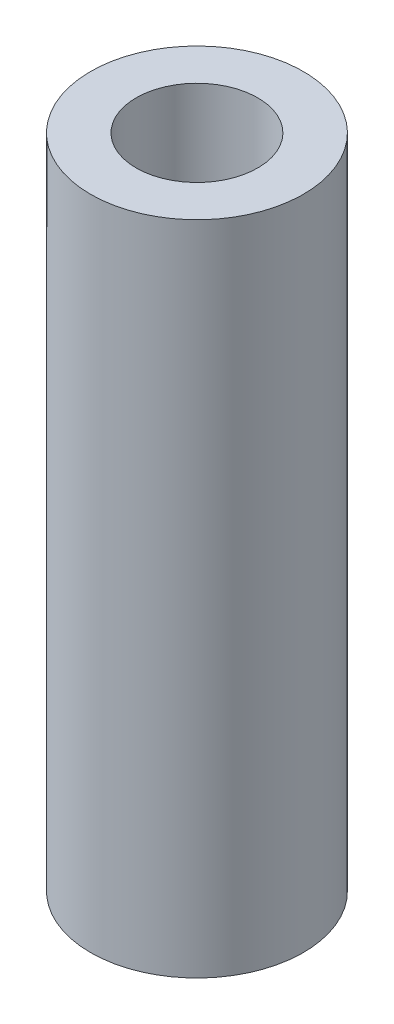
ISO-10303-21;
HEADER;
FILE_DESCRIPTION(('STEP AP214'),'2;1');
FILE_NAME('part.step','',(''),(''),'','','');
FILE_SCHEMA(('AUTOMOTIVE_DESIGN { 1 0 10303 214 1 1 1 1 }'));
ENDSEC;
DATA;
#1=APPLICATION_CONTEXT('core data for automotive mechanical design processes');
#2=APPLICATION_PROTOCOL_DEFINITION('international standard','automotive_design',2000,#1);
#3=PRODUCT_CONTEXT('',#1,'mechanical');
#4=PRODUCT('Part','Part','',(#3));
#5=PRODUCT_RELATED_PRODUCT_CATEGORY('part','',(#4));
#6=PRODUCT_DEFINITION_FORMATION('','',#4);
#7=PRODUCT_DEFINITION_CONTEXT('part definition',#1,'design');
#8=PRODUCT_DEFINITION('design','',#6,#7);
#9=PRODUCT_DEFINITION_SHAPE('','',#8);
#10=(LENGTH_UNIT() NAMED_UNIT(*) SI_UNIT(.MILLI.,.METRE.));
#11=(NAMED_UNIT(*) PLANE_ANGLE_UNIT() SI_UNIT($,.RADIAN.));
#12=(NAMED_UNIT(*) SI_UNIT($,.STERADIAN.) SOLID_ANGLE_UNIT());
#13=UNCERTAINTY_MEASURE_WITH_UNIT(LENGTH_MEASURE(1.E-05),#10,'distance_accuracy_value','');
#14=(GEOMETRIC_REPRESENTATION_CONTEXT(3) GLOBAL_UNCERTAINTY_ASSIGNED_CONTEXT((#13)) GLOBAL_UNIT_ASSIGNED_CONTEXT((#10,
#11,#12)) REPRESENTATION_CONTEXT('',''));
#15=CARTESIAN_POINT('',(0.,0.,0.));
#16=DIRECTION('',(0.,0.,1.));
#17=DIRECTION('',(1.,0.,0.));
#18=AXIS2_PLACEMENT_3D('',#15,#16,#17);
#19=CARTESIAN_POINT('',(0.,27.432,0.));
#20=DIRECTION('',(0.,1.,0.));
#21=DIRECTION('',(0.,0.,1.));
#22=AXIS2_PLACEMENT_3D('',#19,#20,#21);
#23=PLANE('',#22);
#24=CARTESIAN_POINT('',(0.,27.432,0.));
#25=DIRECTION('',(0.,1.,0.));
#26=DIRECTION('',(0.,0.,1.));
#27=AXIS2_PLACEMENT_3D('',#24,#25,#26);
#28=CIRCLE('',#27,4.445);
#29=CARTESIAN_POINT('',(0.,27.432,4.445));
#30=VERTEX_POINT('',#29);
#31=EDGE_CURVE('E10',#30,#30,#28,.T.);
#32=ORIENTED_EDGE('',*,*,#31,.T.);
#33=EDGE_LOOP('',(#32));
#34=FACE_BOUND('',#33,.T.);
#35=CARTESIAN_POINT('',(0.,27.432,0.));
#36=DIRECTION('',(0.,1.,0.));
#37=DIRECTION('',(0.,0.,1.));
#38=AXIS2_PLACEMENT_3D('',#35,#36,#37);
#39=CIRCLE('',#38,2.54);
#40=CARTESIAN_POINT('',(0.,27.432,2.54));
#41=VERTEX_POINT('',#40);
#42=EDGE_CURVE('E41',#41,#41,#39,.T.);
#43=ORIENTED_EDGE('',*,*,#42,.F.);
#44=EDGE_LOOP('',(#43));
#45=FACE_BOUND('',#44,.T.);
#46=ADVANCED_FACE('F30',(#34,#45),#23,.T.);
#47=CARTESIAN_POINT('',(0.,0.,0.));
#48=DIRECTION('',(0.,1.,0.));
#49=DIRECTION('',(0.,0.,1.));
#50=AXIS2_PLACEMENT_3D('',#47,#48,#49);
#51=PLANE('',#50);
#52=CARTESIAN_POINT('',(0.,0.,0.));
#53=DIRECTION('',(0.,1.,0.));
#54=DIRECTION('',(0.,0.,1.));
#55=AXIS2_PLACEMENT_3D('',#52,#53,#54);
#56=CIRCLE('',#55,4.445);
#57=CARTESIAN_POINT('',(0.,0.,4.445));
#58=VERTEX_POINT('',#57);
#59=EDGE_CURVE('E34',#58,#58,#56,.T.);
#60=ORIENTED_EDGE('',*,*,#59,.F.);
#61=EDGE_LOOP('',(#60));
#62=FACE_BOUND('',#61,.T.);
#63=CARTESIAN_POINT('',(0.,0.,0.));
#64=DIRECTION('',(0.,1.,0.));
#65=DIRECTION('',(0.,0.,1.));
#66=AXIS2_PLACEMENT_3D('',#63,#64,#65);
#67=CIRCLE('',#66,2.54);
#68=CARTESIAN_POINT('',(0.,0.,2.54));
#69=VERTEX_POINT('',#68);
#70=EDGE_CURVE('E43',#69,#69,#67,.T.);
#71=ORIENTED_EDGE('',*,*,#70,.T.);
#72=EDGE_LOOP('',(#71));
#73=FACE_BOUND('',#72,.T.);
#74=ADVANCED_FACE('F53',(#62,#73),#51,.F.);
#75=CARTESIAN_POINT('',(0.,27.432,0.));
#76=DIRECTION('',(0.,-1.,0.));
#77=DIRECTION('',(0.,0.,-1.));
#78=AXIS2_PLACEMENT_3D('',#75,#76,#77);
#79=CYLINDRICAL_SURFACE('',#78,4.445);
#80=ORIENTED_EDGE('',*,*,#31,.F.);
#81=EDGE_LOOP('',(#80));
#82=FACE_BOUND('',#81,.T.);
#83=ORIENTED_EDGE('',*,*,#59,.T.);
#84=EDGE_LOOP('',(#83));
#85=FACE_BOUND('',#84,.T.);
#86=ADVANCED_FACE('F32',(#82,#85),#79,.T.);
#87=CARTESIAN_POINT('',(0.,27.432,0.));
#88=DIRECTION('',(0.,-1.,0.));
#89=DIRECTION('',(0.,0.,-1.));
#90=AXIS2_PLACEMENT_3D('',#87,#88,#89);
#91=CYLINDRICAL_SURFACE('',#90,2.54);
#92=ORIENTED_EDGE('',*,*,#42,.T.);
#93=EDGE_LOOP('',(#92));
#94=FACE_BOUND('',#93,.T.);
#95=ORIENTED_EDGE('',*,*,#70,.F.);
#96=EDGE_LOOP('',(#95));
#97=FACE_BOUND('',#96,.T.);
#98=ADVANCED_FACE('F49',(#94,#97),#91,.F.);
#99=CLOSED_SHELL('',(#46,#74,#86,#98));
#100=MANIFOLD_SOLID_BREP('B2',#99);
#101=ADVANCED_BREP_SHAPE_REPRESENTATION('',(#18,#100),#14);
#102=SHAPE_DEFINITION_REPRESENTATION(#9,#101);
ENDSEC;
END-ISO-10303-21;
